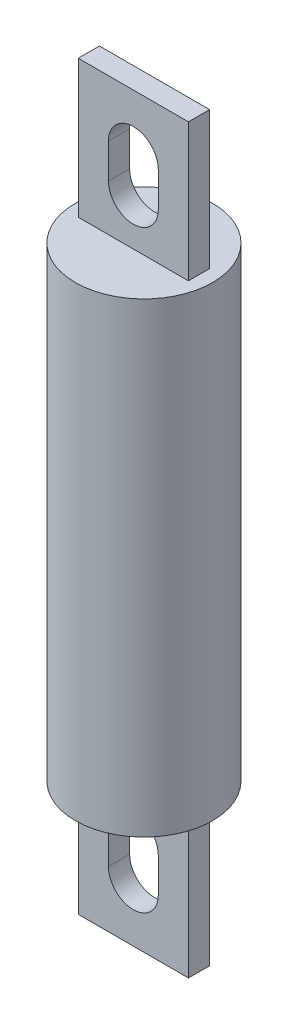
ISO-10303-21;
HEADER;
FILE_DESCRIPTION(('STEP AP214'),'2;1');
FILE_NAME('part.step','',(''),(''),'','','');
FILE_SCHEMA(('AUTOMOTIVE_DESIGN { 1 0 10303 214 1 1 1 1 }'));
ENDSEC;
DATA;
#1=APPLICATION_CONTEXT('core data for automotive mechanical design processes');
#2=APPLICATION_PROTOCOL_DEFINITION('international standard','automotive_design',2000,#1);
#3=PRODUCT_CONTEXT('',#1,'mechanical');
#4=PRODUCT('Part','Part','',(#3));
#5=PRODUCT_RELATED_PRODUCT_CATEGORY('part','',(#4));
#6=PRODUCT_DEFINITION_FORMATION('','',#4);
#7=PRODUCT_DEFINITION_CONTEXT('part definition',#1,'design');
#8=PRODUCT_DEFINITION('design','',#6,#7);
#9=PRODUCT_DEFINITION_SHAPE('','',#8);
#10=(LENGTH_UNIT() NAMED_UNIT(*) SI_UNIT(.MILLI.,.METRE.));
#11=(NAMED_UNIT(*) PLANE_ANGLE_UNIT() SI_UNIT($,.RADIAN.));
#12=(NAMED_UNIT(*) SI_UNIT($,.STERADIAN.) SOLID_ANGLE_UNIT());
#13=UNCERTAINTY_MEASURE_WITH_UNIT(LENGTH_MEASURE(1.E-05),#10,'distance_accuracy_value','');
#14=(GEOMETRIC_REPRESENTATION_CONTEXT(3) GLOBAL_UNCERTAINTY_ASSIGNED_CONTEXT((#13)) GLOBAL_UNIT_ASSIGNED_CONTEXT((#10,
#11,#12)) REPRESENTATION_CONTEXT('',''));
#15=CARTESIAN_POINT('',(0.,0.,0.));
#16=DIRECTION('',(0.,0.,1.));
#17=DIRECTION('',(1.,0.,0.));
#18=AXIS2_PLACEMENT_3D('',#15,#16,#17);
#19=CARTESIAN_POINT('',(-8.255,-20.6375,1.5875));
#20=DIRECTION('',(0.,0.,1.));
#21=DIRECTION('',(1.,0.,0.));
#22=AXIS2_PLACEMENT_3D('',#19,#20,#21);
#23=PLANE('',#22);
#24=DIRECTION('',(1.,0.,0.));
#25=VECTOR('',#24,1.);
#26=CARTESIAN_POINT('',(-8.255,0.,1.5875));
#27=LINE('',#26,#25);
#28=CARTESIAN_POINT('',(-8.255,0.,1.5875));
#29=VERTEX_POINT('',#28);
#30=CARTESIAN_POINT('',(8.255,0.,1.5875));
#31=VERTEX_POINT('',#30);
#32=EDGE_CURVE('E197',#29,#31,#27,.T.);
#33=ORIENTED_EDGE('',*,*,#32,.F.);
#34=DIRECTION('',(0.,1.,0.));
#35=VECTOR('',#34,1.);
#36=CARTESIAN_POINT('',(-8.255,-20.6375,1.5875));
#37=LINE('',#36,#35);
#38=CARTESIAN_POINT('',(-8.255,-20.6375,1.5875));
#39=VERTEX_POINT('',#38);
#40=EDGE_CURVE('E208',#39,#29,#37,.T.);
#41=ORIENTED_EDGE('',*,*,#40,.F.);
#42=DIRECTION('',(1.,0.,0.));
#43=VECTOR('',#42,1.);
#44=CARTESIAN_POINT('',(-8.255,-20.6375,1.5875));
#45=LINE('',#44,#43);
#46=CARTESIAN_POINT('',(8.255,-20.6375,1.5875));
#47=VERTEX_POINT('',#46);
#48=EDGE_CURVE('E184',#39,#47,#45,.T.);
#49=ORIENTED_EDGE('',*,*,#48,.T.);
#50=DIRECTION('',(0.,1.,0.));
#51=VECTOR('',#50,1.);
#52=CARTESIAN_POINT('',(8.255,-20.6375,1.5875));
#53=LINE('',#52,#51);
#54=EDGE_CURVE('E210',#47,#31,#53,.T.);
#55=ORIENTED_EDGE('',*,*,#54,.T.);
#56=EDGE_LOOP('',(#33,#41,#49,#55));
#57=FACE_BOUND('',#56,.T.);
#58=DIRECTION('',(0.,-1.,0.));
#59=VECTOR('',#58,1.);
#60=CARTESIAN_POINT('',(3.7338,-12.1666,1.5875));
#61=LINE('',#60,#59);
#62=CARTESIAN_POINT('',(3.7338,-6.9596,1.5875));
#63=VERTEX_POINT('',#62);
#64=CARTESIAN_POINT('',(3.7338,-12.1666,1.5875));
#65=VERTEX_POINT('',#64);
#66=EDGE_CURVE('E166',#63,#65,#61,.T.);
#67=ORIENTED_EDGE('',*,*,#66,.T.);
#68=CARTESIAN_POINT('',(0.,-12.1666,1.5875));
#69=DIRECTION('',(0.,0.,-1.));
#70=DIRECTION('',(1.,0.,0.));
#71=AXIS2_PLACEMENT_3D('',#68,#69,#70);
#72=CIRCLE('',#71,3.7338);
#73=CARTESIAN_POINT('',(-3.7338,-12.1666,1.5875));
#74=VERTEX_POINT('',#73);
#75=EDGE_CURVE('E56',#65,#74,#72,.T.);
#76=ORIENTED_EDGE('',*,*,#75,.T.);
#77=DIRECTION('',(0.,1.,0.));
#78=VECTOR('',#77,1.);
#79=CARTESIAN_POINT('',(-3.7338,-12.1666,1.5875));
#80=LINE('',#79,#78);
#81=CARTESIAN_POINT('',(-3.7338,-6.9596,1.5875));
#82=VERTEX_POINT('',#81);
#83=EDGE_CURVE('E171',#74,#82,#80,.T.);
#84=ORIENTED_EDGE('',*,*,#83,.T.);
#85=CARTESIAN_POINT('',(0.,-6.9596,1.5875));
#86=DIRECTION('',(0.,0.,-1.));
#87=DIRECTION('',(1.,0.,0.));
#88=AXIS2_PLACEMENT_3D('',#85,#86,#87);
#89=CIRCLE('',#88,3.7338);
#90=EDGE_CURVE('E157',#82,#63,#89,.T.);
#91=ORIENTED_EDGE('',*,*,#90,.T.);
#92=EDGE_LOOP('',(#67,#76,#84,#91));
#93=FACE_BOUND('',#92,.T.);
#94=ADVANCED_FACE('F41',(#57,#93),#23,.T.);
#95=CARTESIAN_POINT('',(-8.255,-20.6375,-1.5875));
#96=DIRECTION('',(0.,0.,-1.));
#97=DIRECTION('',(-1.,0.,0.));
#98=AXIS2_PLACEMENT_3D('',#95,#96,#97);
#99=PLANE('',#98);
#100=DIRECTION('',(-1.,0.,0.));
#101=VECTOR('',#100,1.);
#102=CARTESIAN_POINT('',(-8.255,0.,-1.5875));
#103=LINE('',#102,#101);
#104=CARTESIAN_POINT('',(8.255,0.,-1.5875));
#105=VERTEX_POINT('',#104);
#106=CARTESIAN_POINT('',(-8.255,0.,-1.5875));
#107=VERTEX_POINT('',#106);
#108=EDGE_CURVE('E185',#105,#107,#103,.T.);
#109=ORIENTED_EDGE('',*,*,#108,.F.);
#110=DIRECTION('',(0.,1.,0.));
#111=VECTOR('',#110,1.);
#112=CARTESIAN_POINT('',(8.255,-20.6375,-1.5875));
#113=LINE('',#112,#111);
#114=CARTESIAN_POINT('',(8.255,-20.6375,-1.5875));
#115=VERTEX_POINT('',#114);
#116=EDGE_CURVE('E194',#115,#105,#113,.T.);
#117=ORIENTED_EDGE('',*,*,#116,.F.);
#118=DIRECTION('',(-1.,0.,0.));
#119=VECTOR('',#118,1.);
#120=CARTESIAN_POINT('',(-8.255,-20.6375,-1.5875));
#121=LINE('',#120,#119);
#122=CARTESIAN_POINT('',(-8.255,-20.6375,-1.5875));
#123=VERTEX_POINT('',#122);
#124=EDGE_CURVE('E191',#115,#123,#121,.T.);
#125=ORIENTED_EDGE('',*,*,#124,.T.);
#126=DIRECTION('',(0.,1.,0.));
#127=VECTOR('',#126,1.);
#128=CARTESIAN_POINT('',(-8.255,-20.6375,-1.5875));
#129=LINE('',#128,#127);
#130=EDGE_CURVE('E206',#123,#107,#129,.T.);
#131=ORIENTED_EDGE('',*,*,#130,.T.);
#132=EDGE_LOOP('',(#109,#117,#125,#131));
#133=FACE_BOUND('',#132,.T.);
#134=DIRECTION('',(0.,-1.,0.));
#135=VECTOR('',#134,1.);
#136=CARTESIAN_POINT('',(-3.7338,-20.6375,-1.5875));
#137=LINE('',#136,#135);
#138=CARTESIAN_POINT('',(-3.7338,-6.9596,-1.5875));
#139=VERTEX_POINT('',#138);
#140=CARTESIAN_POINT('',(-3.7338,-12.1666,-1.5875));
#141=VERTEX_POINT('',#140);
#142=EDGE_CURVE('E49',#139,#141,#137,.T.);
#143=ORIENTED_EDGE('',*,*,#142,.T.);
#144=CARTESIAN_POINT('',(0.,-12.1666,-1.5875));
#145=DIRECTION('',(0.,0.,-1.));
#146=DIRECTION('',(-1.,0.,0.));
#147=AXIS2_PLACEMENT_3D('',#144,#145,#146);
#148=CIRCLE('',#147,3.7338);
#149=CARTESIAN_POINT('',(3.7338,-12.1666,-1.5875));
#150=VERTEX_POINT('',#149);
#151=EDGE_CURVE('E11',#141,#150,#148,.F.);
#152=ORIENTED_EDGE('',*,*,#151,.T.);
#153=DIRECTION('',(0.,1.,0.));
#154=VECTOR('',#153,1.);
#155=CARTESIAN_POINT('',(3.7338,-20.6375,-1.5875));
#156=LINE('',#155,#154);
#157=CARTESIAN_POINT('',(3.7338,-6.9596,-1.5875));
#158=VERTEX_POINT('',#157);
#159=EDGE_CURVE('E282',#150,#158,#156,.T.);
#160=ORIENTED_EDGE('',*,*,#159,.T.);
#161=CARTESIAN_POINT('',(0.,-6.9596,-1.5875));
#162=DIRECTION('',(0.,0.,-1.));
#163=DIRECTION('',(-1.,0.,0.));
#164=AXIS2_PLACEMENT_3D('',#161,#162,#163);
#165=CIRCLE('',#164,3.7338);
#166=EDGE_CURVE('E160',#158,#139,#165,.F.);
#167=ORIENTED_EDGE('',*,*,#166,.T.);
#168=EDGE_LOOP('',(#143,#152,#160,#167));
#169=FACE_BOUND('',#168,.T.);
#170=ADVANCED_FACE('F288',(#133,#169),#99,.T.);
#171=CARTESIAN_POINT('',(0.,69.85,0.));
#172=DIRECTION('',(0.,-1.,0.));
#173=DIRECTION('',(0.,0.,-1.));
#174=AXIS2_PLACEMENT_3D('',#171,#172,#173);
#175=CYLINDRICAL_SURFACE('',#174,10.287);
#176=CARTESIAN_POINT('',(0.,69.85,0.));
#177=DIRECTION('',(0.,1.,0.));
#178=DIRECTION('',(0.,0.,1.));
#179=AXIS2_PLACEMENT_3D('',#176,#177,#178);
#180=CIRCLE('',#179,10.287);
#181=CARTESIAN_POINT('',(0.,69.85,10.287));
#182=VERTEX_POINT('',#181);
#183=EDGE_CURVE('E279',#182,#182,#180,.T.);
#184=ORIENTED_EDGE('',*,*,#183,.F.);
#185=EDGE_LOOP('',(#184));
#186=FACE_BOUND('',#185,.T.);
#187=CARTESIAN_POINT('',(0.,0.,0.));
#188=DIRECTION('',(0.,1.,0.));
#189=DIRECTION('',(0.,0.,1.));
#190=AXIS2_PLACEMENT_3D('',#187,#188,#189);
#191=CIRCLE('',#190,10.287);
#192=CARTESIAN_POINT('',(0.,0.,10.287));
#193=VERTEX_POINT('',#192);
#194=EDGE_CURVE('E278',#193,#193,#191,.T.);
#195=ORIENTED_EDGE('',*,*,#194,.T.);
#196=EDGE_LOOP('',(#195));
#197=FACE_BOUND('',#196,.T.);
#198=ADVANCED_FACE('F43',(#186,#197),#175,.T.);
#199=CARTESIAN_POINT('',(0.,69.85,0.));
#200=DIRECTION('',(0.,1.,0.));
#201=DIRECTION('',(0.,0.,1.));
#202=AXIS2_PLACEMENT_3D('',#199,#200,#201);
#203=PLANE('',#202);
#204=DIRECTION('',(0.,0.,-1.));
#205=VECTOR('',#204,1.);
#206=CARTESIAN_POINT('',(8.255,69.85,1.5875));
#207=LINE('',#206,#205);
#208=CARTESIAN_POINT('',(8.255,69.85,1.5875));
#209=VERTEX_POINT('',#208);
#210=CARTESIAN_POINT('',(8.255,69.85,-1.5875));
#211=VERTEX_POINT('',#210);
#212=EDGE_CURVE('E245',#209,#211,#207,.T.);
#213=ORIENTED_EDGE('',*,*,#212,.F.);
#214=DIRECTION('',(1.,0.,0.));
#215=VECTOR('',#214,1.);
#216=CARTESIAN_POINT('',(-8.255,69.85,1.5875));
#217=LINE('',#216,#215);
#218=CARTESIAN_POINT('',(-8.255,69.85,1.5875));
#219=VERTEX_POINT('',#218);
#220=EDGE_CURVE('E250',#219,#209,#217,.T.);
#221=ORIENTED_EDGE('',*,*,#220,.F.);
#222=DIRECTION('',(0.,0.,1.));
#223=VECTOR('',#222,1.);
#224=CARTESIAN_POINT('',(-8.255,69.85,1.5875));
#225=LINE('',#224,#223);
#226=CARTESIAN_POINT('',(-8.255,69.85,-1.5875));
#227=VERTEX_POINT('',#226);
#228=EDGE_CURVE('E262',#227,#219,#225,.T.);
#229=ORIENTED_EDGE('',*,*,#228,.F.);
#230=DIRECTION('',(-1.,0.,0.));
#231=VECTOR('',#230,1.);
#232=CARTESIAN_POINT('',(-8.255,69.85,-1.5875));
#233=LINE('',#232,#231);
#234=EDGE_CURVE('E259',#211,#227,#233,.T.);
#235=ORIENTED_EDGE('',*,*,#234,.F.);
#236=EDGE_LOOP('',(#213,#221,#229,#235));
#237=FACE_BOUND('',#236,.T.);
#238=ORIENTED_EDGE('',*,*,#183,.T.);
#239=EDGE_LOOP('',(#238));
#240=FACE_BOUND('',#239,.T.);
#241=ADVANCED_FACE('F357',(#237,#240),#203,.T.);
#242=CARTESIAN_POINT('',(0.,0.,0.));
#243=DIRECTION('',(0.,1.,0.));
#244=DIRECTION('',(0.,0.,1.));
#245=AXIS2_PLACEMENT_3D('',#242,#243,#244);
#246=PLANE('',#245);
#247=ORIENTED_EDGE('',*,*,#32,.T.);
#248=DIRECTION('',(0.,0.,-1.));
#249=VECTOR('',#248,1.);
#250=CARTESIAN_POINT('',(8.255,0.,1.5875));
#251=LINE('',#250,#249);
#252=EDGE_CURVE('E178',#31,#105,#251,.T.);
#253=ORIENTED_EDGE('',*,*,#252,.T.);
#254=ORIENTED_EDGE('',*,*,#108,.T.);
#255=DIRECTION('',(0.,0.,1.));
#256=VECTOR('',#255,1.);
#257=CARTESIAN_POINT('',(-8.255,0.,1.5875));
#258=LINE('',#257,#256);
#259=EDGE_CURVE('E200',#107,#29,#258,.T.);
#260=ORIENTED_EDGE('',*,*,#259,.T.);
#261=EDGE_LOOP('',(#247,#253,#254,#260));
#262=FACE_BOUND('',#261,.T.);
#263=ORIENTED_EDGE('',*,*,#194,.F.);
#264=EDGE_LOOP('',(#263));
#265=FACE_BOUND('',#264,.T.);
#266=ADVANCED_FACE('F355',(#262,#265),#246,.F.);
#267=CARTESIAN_POINT('',(8.255,90.4875,1.5875));
#268=DIRECTION('',(-1.,0.,0.));
#269=DIRECTION('',(0.,0.,1.));
#270=AXIS2_PLACEMENT_3D('',#267,#268,#269);
#271=PLANE('',#270);
#272=ORIENTED_EDGE('',*,*,#212,.T.);
#273=DIRECTION('',(0.,-1.,0.));
#274=VECTOR('',#273,1.);
#275=CARTESIAN_POINT('',(8.255,90.4875,-1.5875));
#276=LINE('',#275,#274);
#277=CARTESIAN_POINT('',(8.255,90.4875,-1.5875));
#278=VERTEX_POINT('',#277);
#279=EDGE_CURVE('E275',#278,#211,#276,.T.);
#280=ORIENTED_EDGE('',*,*,#279,.F.);
#281=DIRECTION('',(0.,0.,-1.));
#282=VECTOR('',#281,1.);
#283=CARTESIAN_POINT('',(8.255,90.4875,1.5875));
#284=LINE('',#283,#282);
#285=CARTESIAN_POINT('',(8.255,90.4875,1.5875));
#286=VERTEX_POINT('',#285);
#287=EDGE_CURVE('E246',#286,#278,#284,.T.);
#288=ORIENTED_EDGE('',*,*,#287,.F.);
#289=DIRECTION('',(0.,-1.,0.));
#290=VECTOR('',#289,1.);
#291=CARTESIAN_POINT('',(8.255,90.4875,1.5875));
#292=LINE('',#291,#290);
#293=EDGE_CURVE('E256',#286,#209,#292,.T.);
#294=ORIENTED_EDGE('',*,*,#293,.T.);
#295=EDGE_LOOP('',(#272,#280,#288,#294));
#296=FACE_BOUND('',#295,.T.);
#297=ADVANCED_FACE('F351',(#296),#271,.F.);
#298=CARTESIAN_POINT('',(-8.255,90.4875,-1.5875));
#299=DIRECTION('',(0.,0.,1.));
#300=DIRECTION('',(1.,0.,0.));
#301=AXIS2_PLACEMENT_3D('',#298,#299,#300);
#302=PLANE('',#301);
#303=DIRECTION('',(0.,1.,0.));
#304=VECTOR('',#303,1.);
#305=CARTESIAN_POINT('',(3.7338,90.4875,-1.5875));
#306=LINE('',#305,#304);
#307=CARTESIAN_POINT('',(3.7338,76.8096,-1.5875));
#308=VERTEX_POINT('',#307);
#309=CARTESIAN_POINT('',(3.7338,82.0166,-1.5875));
#310=VERTEX_POINT('',#309);
#311=EDGE_CURVE('E239',#308,#310,#306,.T.);
#312=ORIENTED_EDGE('',*,*,#311,.T.);
#313=CARTESIAN_POINT('',(0.,82.0166,-1.5875));
#314=DIRECTION('',(0.,0.,1.));
#315=DIRECTION('',(1.,0.,0.));
#316=AXIS2_PLACEMENT_3D('',#313,#314,#315);
#317=CIRCLE('',#316,3.7338);
#318=CARTESIAN_POINT('',(-3.7338,82.0166,-1.5875));
#319=VERTEX_POINT('',#318);
#320=EDGE_CURVE('E242',#310,#319,#317,.T.);
#321=ORIENTED_EDGE('',*,*,#320,.T.);
#322=DIRECTION('',(0.,-1.,0.));
#323=VECTOR('',#322,1.);
#324=CARTESIAN_POINT('',(-3.7338,90.4875,-1.5875));
#325=LINE('',#324,#323);
#326=CARTESIAN_POINT('',(-3.7338,76.8096,-1.5875));
#327=VERTEX_POINT('',#326);
#328=EDGE_CURVE('E227',#319,#327,#325,.T.);
#329=ORIENTED_EDGE('',*,*,#328,.T.);
#330=CARTESIAN_POINT('',(0.,76.8096,-1.5875));
#331=DIRECTION('',(0.,0.,1.));
#332=DIRECTION('',(1.,0.,0.));
#333=AXIS2_PLACEMENT_3D('',#330,#331,#332);
#334=CIRCLE('',#333,3.7338);
#335=EDGE_CURVE('E236',#327,#308,#334,.T.);
#336=ORIENTED_EDGE('',*,*,#335,.T.);
#337=EDGE_LOOP('',(#312,#321,#329,#336));
#338=FACE_BOUND('',#337,.T.);
#339=ORIENTED_EDGE('',*,*,#234,.T.);
#340=DIRECTION('',(0.,-1.,0.));
#341=VECTOR('',#340,1.);
#342=CARTESIAN_POINT('',(-8.255,90.4875,-1.5875));
#343=LINE('',#342,#341);
#344=CARTESIAN_POINT('',(-8.255,90.4875,-1.5875));
#345=VERTEX_POINT('',#344);
#346=EDGE_CURVE('E272',#345,#227,#343,.T.);
#347=ORIENTED_EDGE('',*,*,#346,.F.);
#348=DIRECTION('',(-1.,0.,0.));
#349=VECTOR('',#348,1.);
#350=CARTESIAN_POINT('',(-8.255,90.4875,-1.5875));
#351=LINE('',#350,#349);
#352=EDGE_CURVE('E249',#278,#345,#351,.T.);
#353=ORIENTED_EDGE('',*,*,#352,.F.);
#354=ORIENTED_EDGE('',*,*,#279,.T.);
#355=EDGE_LOOP('',(#339,#347,#353,#354));
#356=FACE_BOUND('',#355,.T.);
#357=ADVANCED_FACE('F347',(#338,#356),#302,.F.);
#358=CARTESIAN_POINT('',(-8.255,90.4875,1.5875));
#359=DIRECTION('',(1.,0.,0.));
#360=DIRECTION('',(0.,0.,-1.));
#361=AXIS2_PLACEMENT_3D('',#358,#359,#360);
#362=PLANE('',#361);
#363=ORIENTED_EDGE('',*,*,#228,.T.);
#364=DIRECTION('',(0.,-1.,0.));
#365=VECTOR('',#364,1.);
#366=CARTESIAN_POINT('',(-8.255,90.4875,1.5875));
#367=LINE('',#366,#365);
#368=CARTESIAN_POINT('',(-8.255,90.4875,1.5875));
#369=VERTEX_POINT('',#368);
#370=EDGE_CURVE('E269',#369,#219,#367,.T.);
#371=ORIENTED_EDGE('',*,*,#370,.F.);
#372=DIRECTION('',(0.,0.,1.));
#373=VECTOR('',#372,1.);
#374=CARTESIAN_POINT('',(-8.255,90.4875,1.5875));
#375=LINE('',#374,#373);
#376=EDGE_CURVE('E252',#345,#369,#375,.T.);
#377=ORIENTED_EDGE('',*,*,#376,.F.);
#378=ORIENTED_EDGE('',*,*,#346,.T.);
#379=EDGE_LOOP('',(#363,#371,#377,#378));
#380=FACE_BOUND('',#379,.T.);
#381=ADVANCED_FACE('F343',(#380),#362,.F.);
#382=CARTESIAN_POINT('',(-8.255,90.4875,1.5875));
#383=DIRECTION('',(0.,0.,-1.));
#384=DIRECTION('',(-1.,0.,0.));
#385=AXIS2_PLACEMENT_3D('',#382,#383,#384);
#386=PLANE('',#385);
#387=DIRECTION('',(0.,-1.,0.));
#388=VECTOR('',#387,1.);
#389=CARTESIAN_POINT('',(-3.7338,82.0166,1.5875));
#390=LINE('',#389,#388);
#391=CARTESIAN_POINT('',(-3.7338,82.0166,1.5875));
#392=VERTEX_POINT('',#391);
#393=CARTESIAN_POINT('',(-3.7338,76.8096,1.5875));
#394=VERTEX_POINT('',#393);
#395=EDGE_CURVE('E215',#392,#394,#390,.T.);
#396=ORIENTED_EDGE('',*,*,#395,.F.);
#397=CARTESIAN_POINT('',(0.,82.0166,1.5875));
#398=DIRECTION('',(0.,0.,1.));
#399=DIRECTION('',(1.,0.,0.));
#400=AXIS2_PLACEMENT_3D('',#397,#398,#399);
#401=CIRCLE('',#400,3.7338);
#402=CARTESIAN_POINT('',(3.7338,82.0166,1.5875));
#403=VERTEX_POINT('',#402);
#404=EDGE_CURVE('E213',#403,#392,#401,.T.);
#405=ORIENTED_EDGE('',*,*,#404,.F.);
#406=DIRECTION('',(0.,1.,0.));
#407=VECTOR('',#406,1.);
#408=CARTESIAN_POINT('',(3.7338,82.0166,1.5875));
#409=LINE('',#408,#407);
#410=CARTESIAN_POINT('',(3.7338,76.8096,1.5875));
#411=VERTEX_POINT('',#410);
#412=EDGE_CURVE('E221',#411,#403,#409,.T.);
#413=ORIENTED_EDGE('',*,*,#412,.F.);
#414=CARTESIAN_POINT('',(0.,76.8096,1.5875));
#415=DIRECTION('',(0.,0.,1.));
#416=DIRECTION('',(1.,0.,0.));
#417=AXIS2_PLACEMENT_3D('',#414,#415,#416);
#418=CIRCLE('',#417,3.7338);
#419=EDGE_CURVE('E218',#394,#411,#418,.T.);
#420=ORIENTED_EDGE('',*,*,#419,.F.);
#421=EDGE_LOOP('',(#396,#405,#413,#420));
#422=FACE_BOUND('',#421,.T.);
#423=ORIENTED_EDGE('',*,*,#220,.T.);
#424=ORIENTED_EDGE('',*,*,#293,.F.);
#425=DIRECTION('',(1.,0.,0.));
#426=VECTOR('',#425,1.);
#427=CARTESIAN_POINT('',(-8.255,90.4875,1.5875));
#428=LINE('',#427,#426);
#429=EDGE_CURVE('E254',#369,#286,#428,.T.);
#430=ORIENTED_EDGE('',*,*,#429,.F.);
#431=ORIENTED_EDGE('',*,*,#370,.T.);
#432=EDGE_LOOP('',(#423,#424,#430,#431));
#433=FACE_BOUND('',#432,.T.);
#434=ADVANCED_FACE('F339',(#422,#433),#386,.F.);
#435=CARTESIAN_POINT('',(0.,90.4875,0.));
#436=DIRECTION('',(0.,-1.,0.));
#437=DIRECTION('',(0.,0.,-1.));
#438=AXIS2_PLACEMENT_3D('',#435,#436,#437);
#439=PLANE('',#438);
#440=ORIENTED_EDGE('',*,*,#287,.T.);
#441=ORIENTED_EDGE('',*,*,#352,.T.);
#442=ORIENTED_EDGE('',*,*,#376,.T.);
#443=ORIENTED_EDGE('',*,*,#429,.T.);
#444=EDGE_LOOP('',(#440,#441,#442,#443));
#445=FACE_BOUND('',#444,.T.);
#446=ADVANCED_FACE('F335',(#445),#439,.F.);
#447=CARTESIAN_POINT('',(0.,82.0166,-10.287));
#448=DIRECTION('',(0.,0.,1.));
#449=DIRECTION('',(1.,0.,0.));
#450=AXIS2_PLACEMENT_3D('',#447,#448,#449);
#451=CYLINDRICAL_SURFACE('',#450,3.7338);
#452=DIRECTION('',(0.,0.,1.));
#453=VECTOR('',#452,1.);
#454=CARTESIAN_POINT('',(3.7338,82.0166,-10.287));
#455=LINE('',#454,#453);
#456=EDGE_CURVE('E225',#310,#403,#455,.T.);
#457=ORIENTED_EDGE('',*,*,#456,.T.);
#458=ORIENTED_EDGE('',*,*,#404,.T.);
#459=DIRECTION('',(0.,0.,1.));
#460=VECTOR('',#459,1.);
#461=CARTESIAN_POINT('',(-3.7338,82.0166,-10.287));
#462=LINE('',#461,#460);
#463=EDGE_CURVE('E224',#319,#392,#462,.T.);
#464=ORIENTED_EDGE('',*,*,#463,.F.);
#465=ORIENTED_EDGE('',*,*,#320,.F.);
#466=EDGE_LOOP('',(#457,#458,#464,#465));
#467=FACE_BOUND('',#466,.T.);
#468=ADVANCED_FACE('F326',(#467),#451,.F.);
#469=CARTESIAN_POINT('',(3.7338,82.0166,-10.287));
#470=DIRECTION('',(1.,0.,0.));
#471=DIRECTION('',(0.,1.,0.));
#472=AXIS2_PLACEMENT_3D('',#469,#470,#471);
#473=PLANE('',#472);
#474=DIRECTION('',(0.,0.,1.));
#475=VECTOR('',#474,1.);
#476=CARTESIAN_POINT('',(3.7338,76.8096,-10.287));
#477=LINE('',#476,#475);
#478=EDGE_CURVE('E228',#308,#411,#477,.T.);
#479=ORIENTED_EDGE('',*,*,#478,.T.);
#480=ORIENTED_EDGE('',*,*,#412,.T.);
#481=ORIENTED_EDGE('',*,*,#456,.F.);
#482=ORIENTED_EDGE('',*,*,#311,.F.);
#483=EDGE_LOOP('',(#479,#480,#481,#482));
#484=FACE_BOUND('',#483,.T.);
#485=ADVANCED_FACE('F322',(#484),#473,.F.);
#486=CARTESIAN_POINT('',(0.,76.8096,-10.287));
#487=DIRECTION('',(0.,0.,1.));
#488=DIRECTION('',(1.,0.,0.));
#489=AXIS2_PLACEMENT_3D('',#486,#487,#488);
#490=CYLINDRICAL_SURFACE('',#489,3.7338);
#491=DIRECTION('',(0.,0.,1.));
#492=VECTOR('',#491,1.);
#493=CARTESIAN_POINT('',(-3.7338,76.8096,-10.287));
#494=LINE('',#493,#492);
#495=EDGE_CURVE('E230',#327,#394,#494,.T.);
#496=ORIENTED_EDGE('',*,*,#495,.T.);
#497=ORIENTED_EDGE('',*,*,#419,.T.);
#498=ORIENTED_EDGE('',*,*,#478,.F.);
#499=ORIENTED_EDGE('',*,*,#335,.F.);
#500=EDGE_LOOP('',(#496,#497,#498,#499));
#501=FACE_BOUND('',#500,.T.);
#502=ADVANCED_FACE('F325',(#501),#490,.F.);
#503=CARTESIAN_POINT('',(-3.7338,82.0166,-10.287));
#504=DIRECTION('',(-1.,0.,0.));
#505=DIRECTION('',(0.,0.,1.));
#506=AXIS2_PLACEMENT_3D('',#503,#504,#505);
#507=PLANE('',#506);
#508=ORIENTED_EDGE('',*,*,#463,.T.);
#509=ORIENTED_EDGE('',*,*,#395,.T.);
#510=ORIENTED_EDGE('',*,*,#495,.F.);
#511=ORIENTED_EDGE('',*,*,#328,.F.);
#512=EDGE_LOOP('',(#508,#509,#510,#511));
#513=FACE_BOUND('',#512,.T.);
#514=ADVANCED_FACE('F320',(#513),#507,.F.);
#515=CARTESIAN_POINT('',(8.255,-20.6375,1.5875));
#516=DIRECTION('',(1.,0.,0.));
#517=DIRECTION('',(0.,0.,-1.));
#518=AXIS2_PLACEMENT_3D('',#515,#516,#517);
#519=PLANE('',#518);
#520=ORIENTED_EDGE('',*,*,#252,.F.);
#521=ORIENTED_EDGE('',*,*,#54,.F.);
#522=DIRECTION('',(0.,0.,-1.));
#523=VECTOR('',#522,1.);
#524=CARTESIAN_POINT('',(8.255,-20.6375,1.5875));
#525=LINE('',#524,#523);
#526=EDGE_CURVE('E181',#47,#115,#525,.T.);
#527=ORIENTED_EDGE('',*,*,#526,.T.);
#528=ORIENTED_EDGE('',*,*,#116,.T.);
#529=EDGE_LOOP('',(#520,#521,#527,#528));
#530=FACE_BOUND('',#529,.T.);
#531=ADVANCED_FACE('F317',(#530),#519,.T.);
#532=CARTESIAN_POINT('',(-8.255,-20.6375,1.5875));
#533=DIRECTION('',(-1.,0.,0.));
#534=DIRECTION('',(0.,0.,1.));
#535=AXIS2_PLACEMENT_3D('',#532,#533,#534);
#536=PLANE('',#535);
#537=ORIENTED_EDGE('',*,*,#259,.F.);
#538=ORIENTED_EDGE('',*,*,#130,.F.);
#539=DIRECTION('',(0.,0.,1.));
#540=VECTOR('',#539,1.);
#541=CARTESIAN_POINT('',(-8.255,-20.6375,1.5875));
#542=LINE('',#541,#540);
#543=EDGE_CURVE('E188',#123,#39,#542,.T.);
#544=ORIENTED_EDGE('',*,*,#543,.T.);
#545=ORIENTED_EDGE('',*,*,#40,.T.);
#546=EDGE_LOOP('',(#537,#538,#544,#545));
#547=FACE_BOUND('',#546,.T.);
#548=ADVANCED_FACE('F301',(#547),#536,.T.);
#549=CARTESIAN_POINT('',(0.,-20.6375,0.));
#550=DIRECTION('',(0.,1.,0.));
#551=DIRECTION('',(0.,0.,-1.));
#552=AXIS2_PLACEMENT_3D('',#549,#550,#551);
#553=PLANE('',#552);
#554=ORIENTED_EDGE('',*,*,#526,.F.);
#555=ORIENTED_EDGE('',*,*,#48,.F.);
#556=ORIENTED_EDGE('',*,*,#543,.F.);
#557=ORIENTED_EDGE('',*,*,#124,.F.);
#558=EDGE_LOOP('',(#554,#555,#556,#557));
#559=FACE_BOUND('',#558,.T.);
#560=ADVANCED_FACE('F294',(#559),#553,.F.);
#561=CARTESIAN_POINT('',(0.,-12.1666,-10.287));
#562=DIRECTION('',(0.,0.,1.));
#563=DIRECTION('',(1.,0.,0.));
#564=AXIS2_PLACEMENT_3D('',#561,#562,#563);
#565=CYLINDRICAL_SURFACE('',#564,3.7338);
#566=DIRECTION('',(0.,0.,1.));
#567=VECTOR('',#566,1.);
#568=CARTESIAN_POINT('',(-3.7338,-12.1666,-10.287));
#569=LINE('',#568,#567);
#570=EDGE_CURVE('E176',#141,#74,#569,.T.);
#571=ORIENTED_EDGE('',*,*,#570,.T.);
#572=ORIENTED_EDGE('',*,*,#75,.F.);
#573=DIRECTION('',(0.,0.,1.));
#574=VECTOR('',#573,1.);
#575=CARTESIAN_POINT('',(3.7338,-12.1666,-10.287));
#576=LINE('',#575,#574);
#577=EDGE_CURVE('E163',#150,#65,#576,.T.);
#578=ORIENTED_EDGE('',*,*,#577,.F.);
#579=ORIENTED_EDGE('',*,*,#151,.F.);
#580=EDGE_LOOP('',(#571,#572,#578,#579));
#581=FACE_BOUND('',#580,.T.);
#582=ADVANCED_FACE('F292',(#581),#565,.F.);
#583=CARTESIAN_POINT('',(-3.7338,-12.1666,-10.287));
#584=DIRECTION('',(1.,0.,0.));
#585=DIRECTION('',(0.,0.,-1.));
#586=AXIS2_PLACEMENT_3D('',#583,#584,#585);
#587=PLANE('',#586);
#588=DIRECTION('',(0.,0.,1.));
#589=VECTOR('',#588,1.);
#590=CARTESIAN_POINT('',(-3.7338,-6.9596,-10.287));
#591=LINE('',#590,#589);
#592=EDGE_CURVE('E162',#139,#82,#591,.T.);
#593=ORIENTED_EDGE('',*,*,#592,.T.);
#594=ORIENTED_EDGE('',*,*,#83,.F.);
#595=ORIENTED_EDGE('',*,*,#570,.F.);
#596=ORIENTED_EDGE('',*,*,#142,.F.);
#597=EDGE_LOOP('',(#593,#594,#595,#596));
#598=FACE_BOUND('',#597,.T.);
#599=ADVANCED_FACE('F291',(#598),#587,.T.);
#600=CARTESIAN_POINT('',(0.,-6.9596,-10.287));
#601=DIRECTION('',(0.,0.,1.));
#602=DIRECTION('',(1.,0.,0.));
#603=AXIS2_PLACEMENT_3D('',#600,#601,#602);
#604=CYLINDRICAL_SURFACE('',#603,3.7338);
#605=DIRECTION('',(0.,0.,1.));
#606=VECTOR('',#605,1.);
#607=CARTESIAN_POINT('',(3.7338,-6.9596,-10.287));
#608=LINE('',#607,#606);
#609=EDGE_CURVE('E64',#158,#63,#608,.T.);
#610=ORIENTED_EDGE('',*,*,#609,.T.);
#611=ORIENTED_EDGE('',*,*,#90,.F.);
#612=ORIENTED_EDGE('',*,*,#592,.F.);
#613=ORIENTED_EDGE('',*,*,#166,.F.);
#614=EDGE_LOOP('',(#610,#611,#612,#613));
#615=FACE_BOUND('',#614,.T.);
#616=ADVANCED_FACE('F154',(#615),#604,.F.);
#617=CARTESIAN_POINT('',(3.7338,-12.1666,-10.287));
#618=DIRECTION('',(-1.,0.,0.));
#619=DIRECTION('',(0.,-1.,0.));
#620=AXIS2_PLACEMENT_3D('',#617,#618,#619);
#621=PLANE('',#620);
#622=ORIENTED_EDGE('',*,*,#577,.T.);
#623=ORIENTED_EDGE('',*,*,#66,.F.);
#624=ORIENTED_EDGE('',*,*,#609,.F.);
#625=ORIENTED_EDGE('',*,*,#159,.F.);
#626=EDGE_LOOP('',(#622,#623,#624,#625));
#627=FACE_BOUND('',#626,.T.);
#628=ADVANCED_FACE('F167',(#627),#621,.T.);
#629=CLOSED_SHELL('',(#94,#170,#198,#241,#266,#297,#357,#381,#434,#446,#468,#485,#502,#514,#531,
#548,#560,#582,#599,#616,#628));
#630=MANIFOLD_SOLID_BREP('B2',#629);
#631=ADVANCED_BREP_SHAPE_REPRESENTATION('',(#18,#630),#14);
#632=SHAPE_DEFINITION_REPRESENTATION(#9,#631);
ENDSEC;
END-ISO-10303-21;
